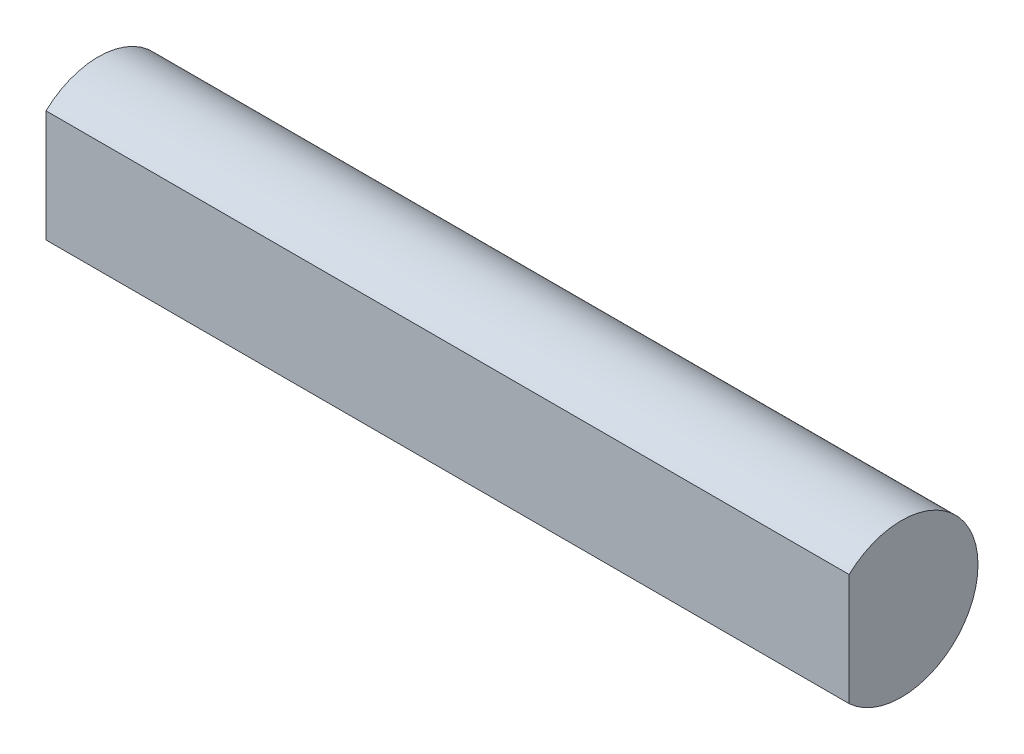
ISO-10303-21;
HEADER;
FILE_DESCRIPTION(('STEP AP214'),'2;1');
FILE_NAME('part.step','',(''),(''),'','','');
FILE_SCHEMA(('AUTOMOTIVE_DESIGN { 1 0 10303 214 1 1 1 1 }'));
ENDSEC;
DATA;
#1=APPLICATION_CONTEXT('core data for automotive mechanical design processes');
#2=APPLICATION_PROTOCOL_DEFINITION('international standard','automotive_design',2000,#1);
#3=PRODUCT_CONTEXT('',#1,'mechanical');
#4=PRODUCT('Part','Part','',(#3));
#5=PRODUCT_RELATED_PRODUCT_CATEGORY('part','',(#4));
#6=PRODUCT_DEFINITION_FORMATION('','',#4);
#7=PRODUCT_DEFINITION_CONTEXT('part definition',#1,'design');
#8=PRODUCT_DEFINITION('design','',#6,#7);
#9=PRODUCT_DEFINITION_SHAPE('','',#8);
#10=(LENGTH_UNIT() NAMED_UNIT(*) SI_UNIT(.MILLI.,.METRE.));
#11=(NAMED_UNIT(*) PLANE_ANGLE_UNIT() SI_UNIT($,.RADIAN.));
#12=(NAMED_UNIT(*) SI_UNIT($,.STERADIAN.) SOLID_ANGLE_UNIT());
#13=UNCERTAINTY_MEASURE_WITH_UNIT(LENGTH_MEASURE(1.E-05),#10,'distance_accuracy_value','');
#14=(GEOMETRIC_REPRESENTATION_CONTEXT(3) GLOBAL_UNCERTAINTY_ASSIGNED_CONTEXT((#13)) GLOBAL_UNIT_ASSIGNED_CONTEXT((#10,
#11,#12)) REPRESENTATION_CONTEXT('',''));
#15=CARTESIAN_POINT('',(0.,0.,0.));
#16=DIRECTION('',(0.,0.,1.));
#17=DIRECTION('',(1.,0.,0.));
#18=AXIS2_PLACEMENT_3D('',#15,#16,#17);
#19=CARTESIAN_POINT('',(43.,0.,2.8));
#20=DIRECTION('',(0.,0.,1.));
#21=DIRECTION('',(1.,0.,0.));
#22=AXIS2_PLACEMENT_3D('',#19,#20,#21);
#23=PLANE('',#22);
#24=DIRECTION('',(0.,1.,0.));
#25=VECTOR('',#24,1.);
#26=CARTESIAN_POINT('',(0.,0.,2.8));
#27=LINE('',#26,#25);
#28=CARTESIAN_POINT('',(0.,-2.99499582637439,2.8));
#29=VERTEX_POINT('',#28);
#30=CARTESIAN_POINT('',(0.,2.99499582637439,2.8));
#31=VERTEX_POINT('',#30);
#32=EDGE_CURVE('E69',#29,#31,#27,.T.);
#33=ORIENTED_EDGE('',*,*,#32,.F.);
#34=DIRECTION('',(-1.,0.,0.));
#35=VECTOR('',#34,1.);
#36=CARTESIAN_POINT('',(43.,-2.99499582637439,2.8));
#37=LINE('',#36,#35);
#38=CARTESIAN_POINT('',(43.,-2.99499582637439,2.8));
#39=VERTEX_POINT('',#38);
#40=EDGE_CURVE('E11',#39,#29,#37,.T.);
#41=ORIENTED_EDGE('',*,*,#40,.F.);
#42=DIRECTION('',(0.,1.,0.));
#43=VECTOR('',#42,1.);
#44=CARTESIAN_POINT('',(43.,0.,2.8));
#45=LINE('',#44,#43);
#46=CARTESIAN_POINT('',(43.,2.99499582637439,2.8));
#47=VERTEX_POINT('',#46);
#48=EDGE_CURVE('E70',#39,#47,#45,.T.);
#49=ORIENTED_EDGE('',*,*,#48,.T.);
#50=DIRECTION('',(-1.,0.,0.));
#51=VECTOR('',#50,1.);
#52=CARTESIAN_POINT('',(43.,2.99499582637439,2.8));
#53=LINE('',#52,#51);
#54=EDGE_CURVE('E49',#47,#31,#53,.T.);
#55=ORIENTED_EDGE('',*,*,#54,.T.);
#56=EDGE_LOOP('',(#33,#41,#49,#55));
#57=FACE_BOUND('',#56,.T.);
#58=ADVANCED_FACE('F41',(#57),#23,.T.);
#59=CARTESIAN_POINT('',(43.,0.,0.));
#60=DIRECTION('',(-1.,0.,0.));
#61=DIRECTION('',(0.,0.,1.));
#62=AXIS2_PLACEMENT_3D('',#59,#60,#61);
#63=CYLINDRICAL_SURFACE('',#62,4.1);
#64=CARTESIAN_POINT('',(0.,0.,0.));
#65=DIRECTION('',(1.,0.,0.));
#66=DIRECTION('',(0.,0.,-1.));
#67=AXIS2_PLACEMENT_3D('',#64,#65,#66);
#68=CIRCLE('',#67,4.1);
#69=EDGE_CURVE('E71',#29,#31,#68,.T.);
#70=ORIENTED_EDGE('',*,*,#69,.T.);
#71=ORIENTED_EDGE('',*,*,#54,.F.);
#72=CARTESIAN_POINT('',(43.,0.,0.));
#73=DIRECTION('',(1.,0.,0.));
#74=DIRECTION('',(0.,0.,-1.));
#75=AXIS2_PLACEMENT_3D('',#72,#73,#74);
#76=CIRCLE('',#75,4.1);
#77=EDGE_CURVE('E56',#39,#47,#76,.T.);
#78=ORIENTED_EDGE('',*,*,#77,.F.);
#79=ORIENTED_EDGE('',*,*,#40,.T.);
#80=EDGE_LOOP('',(#70,#71,#78,#79));
#81=FACE_BOUND('',#80,.T.);
#82=ADVANCED_FACE('F72',(#81),#63,.T.);
#83=CARTESIAN_POINT('',(43.,0.,0.));
#84=DIRECTION('',(1.,0.,0.));
#85=DIRECTION('',(0.,0.,-1.));
#86=AXIS2_PLACEMENT_3D('',#83,#84,#85);
#87=PLANE('',#86);
#88=ORIENTED_EDGE('',*,*,#48,.F.);
#89=ORIENTED_EDGE('',*,*,#77,.T.);
#90=EDGE_LOOP('',(#88,#89));
#91=FACE_BOUND('',#90,.T.);
#92=ADVANCED_FACE('F80',(#91),#87,.T.);
#93=CARTESIAN_POINT('',(0.,0.,0.));
#94=DIRECTION('',(1.,0.,0.));
#95=DIRECTION('',(0.,0.,-1.));
#96=AXIS2_PLACEMENT_3D('',#93,#94,#95);
#97=PLANE('',#96);
#98=ORIENTED_EDGE('',*,*,#32,.T.);
#99=ORIENTED_EDGE('',*,*,#69,.F.);
#100=EDGE_LOOP('',(#98,#99));
#101=FACE_BOUND('',#100,.T.);
#102=ADVANCED_FACE('F75',(#101),#97,.F.);
#103=CLOSED_SHELL('',(#58,#82,#92,#102));
#104=MANIFOLD_SOLID_BREP('B2',#103);
#105=ADVANCED_BREP_SHAPE_REPRESENTATION('',(#18,#104),#14);
#106=SHAPE_DEFINITION_REPRESENTATION(#9,#105);
ENDSEC;
END-ISO-10303-21;
